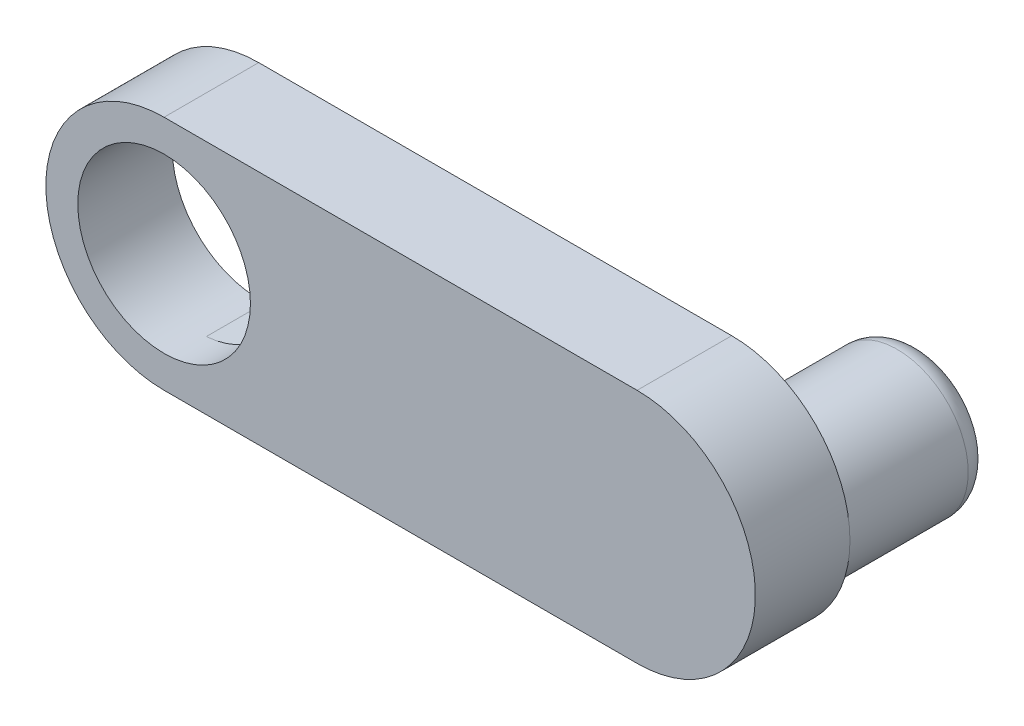
ISO-10303-21;
HEADER;
FILE_DESCRIPTION(('STEP AP214'),'2;1');
FILE_NAME('part.step','',(''),(''),'','','');
FILE_SCHEMA(('AUTOMOTIVE_DESIGN { 1 0 10303 214 1 1 1 1 }'));
ENDSEC;
DATA;
#1=APPLICATION_CONTEXT('core data for automotive mechanical design processes');
#2=APPLICATION_PROTOCOL_DEFINITION('international standard','automotive_design',2000,#1);
#3=PRODUCT_CONTEXT('',#1,'mechanical');
#4=PRODUCT('Part','Part','',(#3));
#5=PRODUCT_RELATED_PRODUCT_CATEGORY('part','',(#4));
#6=PRODUCT_DEFINITION_FORMATION('','',#4);
#7=PRODUCT_DEFINITION_CONTEXT('part definition',#1,'design');
#8=PRODUCT_DEFINITION('design','',#6,#7);
#9=PRODUCT_DEFINITION_SHAPE('','',#8);
#10=(LENGTH_UNIT() NAMED_UNIT(*) SI_UNIT(.MILLI.,.METRE.));
#11=(NAMED_UNIT(*) PLANE_ANGLE_UNIT() SI_UNIT($,.RADIAN.));
#12=(NAMED_UNIT(*) SI_UNIT($,.STERADIAN.) SOLID_ANGLE_UNIT());
#13=UNCERTAINTY_MEASURE_WITH_UNIT(LENGTH_MEASURE(1.E-05),#10,'distance_accuracy_value','');
#14=(GEOMETRIC_REPRESENTATION_CONTEXT(3) GLOBAL_UNCERTAINTY_ASSIGNED_CONTEXT((#13)) GLOBAL_UNIT_ASSIGNED_CONTEXT((#10,
#11,#12)) REPRESENTATION_CONTEXT('',''));
#15=CARTESIAN_POINT('',(0.,0.,0.));
#16=DIRECTION('',(0.,0.,1.));
#17=DIRECTION('',(1.,0.,0.));
#18=AXIS2_PLACEMENT_3D('',#15,#16,#17);
#19=CARTESIAN_POINT('',(0.,0.,4.));
#20=DIRECTION('',(0.,0.,-1.));
#21=DIRECTION('',(-1.,0.,0.));
#22=AXIS2_PLACEMENT_3D('',#19,#20,#21);
#23=CYLINDRICAL_SURFACE('',#22,5.);
#24=CARTESIAN_POINT('',(0.,0.,0.));
#25=DIRECTION('',(0.,0.,1.));
#26=DIRECTION('',(1.,0.,0.));
#27=AXIS2_PLACEMENT_3D('',#24,#25,#26);
#28=CIRCLE('',#27,5.);
#29=CARTESIAN_POINT('',(0.,5.,0.));
#30=VERTEX_POINT('',#29);
#31=CARTESIAN_POINT('',(0.,-5.,0.));
#32=VERTEX_POINT('',#31);
#33=EDGE_CURVE('E145',#30,#32,#28,.T.);
#34=ORIENTED_EDGE('',*,*,#33,.T.);
#35=DIRECTION('',(0.,0.,-1.));
#36=VECTOR('',#35,1.);
#37=CARTESIAN_POINT('',(0.,-5.,4.));
#38=LINE('',#37,#36);
#39=CARTESIAN_POINT('',(0.,-5.,4.));
#40=VERTEX_POINT('',#39);
#41=EDGE_CURVE('E175',#40,#32,#38,.T.);
#42=ORIENTED_EDGE('',*,*,#41,.F.);
#43=CARTESIAN_POINT('',(0.,0.,4.));
#44=DIRECTION('',(0.,0.,1.));
#45=DIRECTION('',(1.,0.,0.));
#46=AXIS2_PLACEMENT_3D('',#43,#44,#45);
#47=CIRCLE('',#46,5.);
#48=CARTESIAN_POINT('',(0.,5.,4.));
#49=VERTEX_POINT('',#48);
#50=EDGE_CURVE('E141',#49,#40,#47,.T.);
#51=ORIENTED_EDGE('',*,*,#50,.F.);
#52=DIRECTION('',(0.,0.,-1.));
#53=VECTOR('',#52,1.);
#54=CARTESIAN_POINT('',(0.,5.,4.));
#55=LINE('',#54,#53);
#56=EDGE_CURVE('E153',#49,#30,#55,.T.);
#57=ORIENTED_EDGE('',*,*,#56,.T.);
#58=EDGE_LOOP('',(#34,#42,#51,#57));
#59=FACE_BOUND('',#58,.T.);
#60=ADVANCED_FACE('F41',(#59),#23,.T.);
#61=CARTESIAN_POINT('',(0.,-5.,4.));
#62=DIRECTION('',(0.,1.,0.));
#63=DIRECTION('',(0.,0.,1.));
#64=AXIS2_PLACEMENT_3D('',#61,#62,#63);
#65=PLANE('',#64);
#66=DIRECTION('',(1.,0.,0.));
#67=VECTOR('',#66,1.);
#68=CARTESIAN_POINT('',(0.,-5.,0.));
#69=LINE('',#68,#67);
#70=CARTESIAN_POINT('',(20.,-5.,0.));
#71=VERTEX_POINT('',#70);
#72=EDGE_CURVE('E160',#32,#71,#69,.T.);
#73=ORIENTED_EDGE('',*,*,#72,.T.);
#74=DIRECTION('',(0.,0.,-1.));
#75=VECTOR('',#74,1.);
#76=CARTESIAN_POINT('',(20.,-5.,4.));
#77=LINE('',#76,#75);
#78=CARTESIAN_POINT('',(20.,-5.,4.));
#79=VERTEX_POINT('',#78);
#80=EDGE_CURVE('E169',#79,#71,#77,.T.);
#81=ORIENTED_EDGE('',*,*,#80,.F.);
#82=DIRECTION('',(1.,0.,0.));
#83=VECTOR('',#82,1.);
#84=CARTESIAN_POINT('',(0.,-5.,4.));
#85=LINE('',#84,#83);
#86=EDGE_CURVE('E147',#40,#79,#85,.T.);
#87=ORIENTED_EDGE('',*,*,#86,.F.);
#88=ORIENTED_EDGE('',*,*,#41,.T.);
#89=EDGE_LOOP('',(#73,#81,#87,#88));
#90=FACE_BOUND('',#89,.T.);
#91=ADVANCED_FACE('F186',(#90),#65,.F.);
#92=CARTESIAN_POINT('',(20.,0.,4.));
#93=DIRECTION('',(0.,0.,-1.));
#94=DIRECTION('',(-1.,0.,0.));
#95=AXIS2_PLACEMENT_3D('',#92,#93,#94);
#96=CYLINDRICAL_SURFACE('',#95,5.);
#97=CARTESIAN_POINT('',(20.,0.,0.));
#98=DIRECTION('',(0.,0.,1.));
#99=DIRECTION('',(1.,0.,0.));
#100=AXIS2_PLACEMENT_3D('',#97,#98,#99);
#101=CIRCLE('',#100,5.);
#102=CARTESIAN_POINT('',(25.,0.,0.));
#103=VERTEX_POINT('',#102);
#104=EDGE_CURVE('E158',#71,#103,#101,.T.);
#105=ORIENTED_EDGE('',*,*,#104,.T.);
#106=CARTESIAN_POINT('',(20.,5.,0.));
#107=VERTEX_POINT('',#106);
#108=EDGE_CURVE('E156',#103,#107,#101,.T.);
#109=ORIENTED_EDGE('',*,*,#108,.T.);
#110=DIRECTION('',(0.,0.,-1.));
#111=VECTOR('',#110,1.);
#112=CARTESIAN_POINT('',(20.,5.,4.));
#113=LINE('',#112,#111);
#114=CARTESIAN_POINT('',(20.,5.,4.));
#115=VERTEX_POINT('',#114);
#116=EDGE_CURVE('E168',#115,#107,#113,.T.);
#117=ORIENTED_EDGE('',*,*,#116,.F.);
#118=CARTESIAN_POINT('',(20.,0.,4.));
#119=DIRECTION('',(0.,0.,1.));
#120=DIRECTION('',(1.,0.,0.));
#121=AXIS2_PLACEMENT_3D('',#118,#119,#120);
#122=CIRCLE('',#121,5.);
#123=EDGE_CURVE('E146',#79,#115,#122,.T.);
#124=ORIENTED_EDGE('',*,*,#123,.F.);
#125=ORIENTED_EDGE('',*,*,#80,.T.);
#126=EDGE_LOOP('',(#105,#109,#117,#124,#125));
#127=FACE_BOUND('',#126,.T.);
#128=ADVANCED_FACE('F191',(#127),#96,.T.);
#129=CARTESIAN_POINT('',(0.,5.,4.));
#130=DIRECTION('',(0.,1.,0.));
#131=DIRECTION('',(0.,0.,1.));
#132=AXIS2_PLACEMENT_3D('',#129,#130,#131);
#133=PLANE('',#132);
#134=DIRECTION('',(1.,0.,0.));
#135=VECTOR('',#134,1.);
#136=CARTESIAN_POINT('',(0.,5.,0.));
#137=LINE('',#136,#135);
#138=EDGE_CURVE('E150',#30,#107,#137,.T.);
#139=ORIENTED_EDGE('',*,*,#138,.F.);
#140=ORIENTED_EDGE('',*,*,#56,.F.);
#141=DIRECTION('',(1.,0.,0.));
#142=VECTOR('',#141,1.);
#143=CARTESIAN_POINT('',(0.,5.,4.));
#144=LINE('',#143,#142);
#145=EDGE_CURVE('E151',#49,#115,#144,.T.);
#146=ORIENTED_EDGE('',*,*,#145,.T.);
#147=ORIENTED_EDGE('',*,*,#116,.T.);
#148=EDGE_LOOP('',(#139,#140,#146,#147));
#149=FACE_BOUND('',#148,.T.);
#150=ADVANCED_FACE('F200',(#149),#133,.T.);
#151=CARTESIAN_POINT('',(0.,0.,4.));
#152=DIRECTION('',(0.,0.,1.));
#153=DIRECTION('',(1.,0.,0.));
#154=AXIS2_PLACEMENT_3D('',#151,#152,#153);
#155=PLANE('',#154);
#156=CARTESIAN_POINT('',(0.,0.,4.));
#157=DIRECTION('',(0.,0.,-1.));
#158=DIRECTION('',(-1.,0.,0.));
#159=AXIS2_PLACEMENT_3D('',#156,#157,#158);
#160=CIRCLE('',#159,3.65);
#161=CARTESIAN_POINT('',(-3.65,0.,4.));
#162=VERTEX_POINT('',#161);
#163=EDGE_CURVE('E118',#162,#162,#160,.T.);
#164=ORIENTED_EDGE('',*,*,#163,.T.);
#165=EDGE_LOOP('',(#164));
#166=FACE_BOUND('',#165,.T.);
#167=ORIENTED_EDGE('',*,*,#50,.T.);
#168=ORIENTED_EDGE('',*,*,#86,.T.);
#169=ORIENTED_EDGE('',*,*,#123,.T.);
#170=ORIENTED_EDGE('',*,*,#145,.F.);
#171=EDGE_LOOP('',(#167,#168,#169,#170));
#172=FACE_BOUND('',#171,.T.);
#173=ADVANCED_FACE('F201',(#166,#172),#155,.T.);
#174=CARTESIAN_POINT('',(0.,0.,0.));
#175=DIRECTION('',(0.,0.,1.));
#176=DIRECTION('',(1.,0.,0.));
#177=AXIS2_PLACEMENT_3D('',#174,#175,#176);
#178=PLANE('',#177);
#179=DIRECTION('',(-0.996943571309329,-0.0781250000000001,0.));
#180=VECTOR('',#179,1.);
#181=CARTESIAN_POINT('',(16.1875,-2.39266457114239,0.));
#182=LINE('',#181,#180);
#183=CARTESIAN_POINT('',(16.1875,-2.39266457114239,0.));
#184=VERTEX_POINT('',#183);
#185=CARTESIAN_POINT('',(0.285156250000001,-3.63884403527905,0.));
#186=VERTEX_POINT('',#185);
#187=EDGE_CURVE('E315',#184,#186,#182,.T.);
#188=ORIENTED_EDGE('',*,*,#187,.F.);
#189=CARTESIAN_POINT('',(16.,0.,0.));
#190=DIRECTION('',(0.,0.,-1.));
#191=DIRECTION('',(-1.,0.,0.));
#192=AXIS2_PLACEMENT_3D('',#189,#190,#191);
#193=CIRCLE('',#192,2.4);
#194=CARTESIAN_POINT('',(16.1875,2.39266457114239,0.));
#195=VERTEX_POINT('',#194);
#196=EDGE_CURVE('E57',#195,#184,#193,.T.);
#197=ORIENTED_EDGE('',*,*,#196,.F.);
#198=DIRECTION('',(-0.996943571309329,0.0781250000000001,0.));
#199=VECTOR('',#198,1.);
#200=CARTESIAN_POINT('',(16.1875,2.39266457114239,0.));
#201=LINE('',#200,#199);
#202=CARTESIAN_POINT('',(0.28515625,3.63884403527905,0.));
#203=VERTEX_POINT('',#202);
#204=EDGE_CURVE('E314',#195,#203,#201,.T.);
#205=ORIENTED_EDGE('',*,*,#204,.T.);
#206=CARTESIAN_POINT('',(0.,0.,0.));
#207=DIRECTION('',(0.,0.,-1.));
#208=DIRECTION('',(-1.,0.,0.));
#209=AXIS2_PLACEMENT_3D('',#206,#207,#208);
#210=CIRCLE('',#209,3.65);
#211=EDGE_CURVE('E132',#186,#203,#210,.T.);
#212=ORIENTED_EDGE('',*,*,#211,.F.);
#213=EDGE_LOOP('',(#188,#197,#205,#212));
#214=FACE_BOUND('',#213,.T.);
#215=ORIENTED_EDGE('',*,*,#108,.F.);
#216=CARTESIAN_POINT('',(22.,0.,0.));
#217=DIRECTION('',(0.,0.,1.));
#218=DIRECTION('',(1.,0.,0.));
#219=AXIS2_PLACEMENT_3D('',#216,#217,#218);
#220=CIRCLE('',#219,3.);
#221=EDGE_CURVE('E65',#103,#103,#220,.T.);
#222=ORIENTED_EDGE('',*,*,#221,.T.);
#223=ORIENTED_EDGE('',*,*,#104,.F.);
#224=ORIENTED_EDGE('',*,*,#72,.F.);
#225=ORIENTED_EDGE('',*,*,#33,.F.);
#226=ORIENTED_EDGE('',*,*,#138,.T.);
#227=EDGE_LOOP('',(#215,#222,#223,#224,#225,#226));
#228=FACE_BOUND('',#227,.T.);
#229=ADVANCED_FACE('F207',(#214,#228),#178,.F.);
#230=CARTESIAN_POINT('',(22.,0.,-6.));
#231=DIRECTION('',(0.,0.,1.));
#232=DIRECTION('',(1.,0.,0.));
#233=AXIS2_PLACEMENT_3D('',#230,#231,#232);
#234=CYLINDRICAL_SURFACE('',#233,3.);
#235=CARTESIAN_POINT('',(22.,0.,-5.));
#236=DIRECTION('',(0.,0.,1.));
#237=DIRECTION('',(1.,0.,0.));
#238=AXIS2_PLACEMENT_3D('',#235,#236,#237);
#239=CIRCLE('',#238,3.);
#240=CARTESIAN_POINT('',(25.,0.,-5.));
#241=VERTEX_POINT('',#240);
#242=EDGE_CURVE('E47',#241,#241,#239,.T.);
#243=ORIENTED_EDGE('',*,*,#242,.T.);
#244=EDGE_LOOP('',(#243));
#245=FACE_BOUND('',#244,.T.);
#246=ORIENTED_EDGE('',*,*,#221,.F.);
#247=EDGE_LOOP('',(#246));
#248=FACE_BOUND('',#247,.T.);
#249=ADVANCED_FACE('F180',(#245,#248),#234,.T.);
#250=CARTESIAN_POINT('',(22.,0.,-6.));
#251=DIRECTION('',(0.,0.,1.));
#252=DIRECTION('',(1.,0.,0.));
#253=AXIS2_PLACEMENT_3D('',#250,#251,#252);
#254=PLANE('',#253);
#255=CARTESIAN_POINT('',(22.,0.,-6.));
#256=DIRECTION('',(0.,0.,1.));
#257=DIRECTION('',(1.,0.,0.));
#258=AXIS2_PLACEMENT_3D('',#255,#256,#257);
#259=CIRCLE('',#258,2.);
#260=CARTESIAN_POINT('',(24.,0.,-6.));
#261=VERTEX_POINT('',#260);
#262=EDGE_CURVE('E11',#261,#261,#259,.F.);
#263=ORIENTED_EDGE('',*,*,#262,.T.);
#264=EDGE_LOOP('',(#263));
#265=FACE_BOUND('',#264,.T.);
#266=ADVANCED_FACE('F213',(#265),#254,.F.);
#267=CARTESIAN_POINT('',(16.,0.,2.5));
#268=DIRECTION('',(0.,0.,-1.));
#269=DIRECTION('',(-1.,0.,0.));
#270=AXIS2_PLACEMENT_3D('',#267,#268,#269);
#271=CYLINDRICAL_SURFACE('',#270,2.4);
#272=ORIENTED_EDGE('',*,*,#196,.T.);
#273=DIRECTION('',(0.,0.,-1.));
#274=VECTOR('',#273,1.);
#275=CARTESIAN_POINT('',(16.1875,-2.39266457114239,2.5));
#276=LINE('',#275,#274);
#277=CARTESIAN_POINT('',(16.1875,-2.39266457114239,2.5));
#278=VERTEX_POINT('',#277);
#279=EDGE_CURVE('E130',#278,#184,#276,.T.);
#280=ORIENTED_EDGE('',*,*,#279,.F.);
#281=CARTESIAN_POINT('',(16.,0.,2.5));
#282=DIRECTION('',(0.,0.,-1.));
#283=DIRECTION('',(-1.,0.,0.));
#284=AXIS2_PLACEMENT_3D('',#281,#282,#283);
#285=CIRCLE('',#284,2.4);
#286=CARTESIAN_POINT('',(16.1875,2.39266457114239,2.5));
#287=VERTEX_POINT('',#286);
#288=EDGE_CURVE('E320',#287,#278,#285,.T.);
#289=ORIENTED_EDGE('',*,*,#288,.F.);
#290=DIRECTION('',(0.,0.,-1.));
#291=VECTOR('',#290,1.);
#292=CARTESIAN_POINT('',(16.1875,2.39266457114239,2.5));
#293=LINE('',#292,#291);
#294=EDGE_CURVE('E127',#287,#195,#293,.T.);
#295=ORIENTED_EDGE('',*,*,#294,.T.);
#296=EDGE_LOOP('',(#272,#280,#289,#295));
#297=FACE_BOUND('',#296,.T.);
#298=ADVANCED_FACE('F217',(#297),#271,.F.);
#299=CARTESIAN_POINT('',(16.1875,2.39266457114239,2.5));
#300=DIRECTION('',(-0.0781250000000001,-0.99694357130933,0.));
#301=DIRECTION('',(0.99694357130933,-0.0781250000000001,0.));
#302=AXIS2_PLACEMENT_3D('',#299,#300,#301);
#303=PLANE('',#302);
#304=ORIENTED_EDGE('',*,*,#204,.F.);
#305=ORIENTED_EDGE('',*,*,#294,.F.);
#306=DIRECTION('',(-0.996943571309329,0.0781250000000001,0.));
#307=VECTOR('',#306,1.);
#308=CARTESIAN_POINT('',(16.1875,2.39266457114239,2.5));
#309=LINE('',#308,#307);
#310=CARTESIAN_POINT('',(0.28515625,3.63884403527905,2.5));
#311=VERTEX_POINT('',#310);
#312=EDGE_CURVE('E115',#287,#311,#309,.T.);
#313=ORIENTED_EDGE('',*,*,#312,.T.);
#314=DIRECTION('',(0.,0.,-1.));
#315=VECTOR('',#314,1.);
#316=CARTESIAN_POINT('',(0.28515625,3.63884403527905,2.5));
#317=LINE('',#316,#315);
#318=EDGE_CURVE('E121',#311,#203,#317,.T.);
#319=ORIENTED_EDGE('',*,*,#318,.T.);
#320=EDGE_LOOP('',(#304,#305,#313,#319));
#321=FACE_BOUND('',#320,.T.);
#322=ADVANCED_FACE('F124',(#321),#303,.T.);
#323=CARTESIAN_POINT('',(0.,0.,2.5));
#324=DIRECTION('',(0.,0.,-1.));
#325=DIRECTION('',(-1.,0.,0.));
#326=AXIS2_PLACEMENT_3D('',#323,#324,#325);
#327=CYLINDRICAL_SURFACE('',#326,3.65);
#328=ORIENTED_EDGE('',*,*,#211,.T.);
#329=ORIENTED_EDGE('',*,*,#318,.F.);
#330=CARTESIAN_POINT('',(0.,0.,2.5));
#331=DIRECTION('',(0.,0.,-1.));
#332=DIRECTION('',(-1.,0.,0.));
#333=AXIS2_PLACEMENT_3D('',#330,#331,#332);
#334=CIRCLE('',#333,3.65);
#335=CARTESIAN_POINT('',(0.285156250000001,-3.63884403527905,2.5));
#336=VERTEX_POINT('',#335);
#337=EDGE_CURVE('E108',#311,#336,#334,.T.);
#338=ORIENTED_EDGE('',*,*,#337,.T.);
#339=DIRECTION('',(0.,0.,-1.));
#340=VECTOR('',#339,1.);
#341=CARTESIAN_POINT('',(0.285156250000001,-3.63884403527905,2.5));
#342=LINE('',#341,#340);
#343=EDGE_CURVE('E133',#336,#186,#342,.T.);
#344=ORIENTED_EDGE('',*,*,#343,.T.);
#345=EDGE_LOOP('',(#328,#329,#338,#344));
#346=FACE_BOUND('',#345,.T.);
#347=ORIENTED_EDGE('',*,*,#163,.F.);
#348=EDGE_LOOP('',(#347));
#349=FACE_BOUND('',#348,.T.);
#350=ADVANCED_FACE('F126',(#346,#349),#327,.F.);
#351=CARTESIAN_POINT('',(16.1875,-2.39266457114239,2.5));
#352=DIRECTION('',(0.0781250000000001,-0.99694357130933,0.));
#353=DIRECTION('',(0.99694357130933,0.0781250000000001,0.));
#354=AXIS2_PLACEMENT_3D('',#351,#352,#353);
#355=PLANE('',#354);
#356=ORIENTED_EDGE('',*,*,#187,.T.);
#357=ORIENTED_EDGE('',*,*,#343,.F.);
#358=DIRECTION('',(-0.996943571309329,-0.0781250000000001,0.));
#359=VECTOR('',#358,1.);
#360=CARTESIAN_POINT('',(16.1875,-2.39266457114239,2.5));
#361=LINE('',#360,#359);
#362=EDGE_CURVE('E114',#278,#336,#361,.T.);
#363=ORIENTED_EDGE('',*,*,#362,.F.);
#364=ORIENTED_EDGE('',*,*,#279,.T.);
#365=EDGE_LOOP('',(#356,#357,#363,#364));
#366=FACE_BOUND('',#365,.T.);
#367=ADVANCED_FACE('F184',(#366),#355,.F.);
#368=CARTESIAN_POINT('',(16.,0.,2.5));
#369=DIRECTION('',(0.,0.,-1.));
#370=DIRECTION('',(-1.,0.,0.));
#371=AXIS2_PLACEMENT_3D('',#368,#369,#370);
#372=PLANE('',#371);
#373=ORIENTED_EDGE('',*,*,#337,.F.);
#374=ORIENTED_EDGE('',*,*,#312,.F.);
#375=ORIENTED_EDGE('',*,*,#288,.T.);
#376=ORIENTED_EDGE('',*,*,#362,.T.);
#377=EDGE_LOOP('',(#373,#374,#375,#376));
#378=FACE_BOUND('',#377,.T.);
#379=ADVANCED_FACE('F109',(#378),#372,.T.);
#380=CARTESIAN_POINT('',(22.,0.,-5.));
#381=DIRECTION('',(0.,0.,1.));
#382=DIRECTION('',(1.,0.,0.));
#383=AXIS2_PLACEMENT_3D('',#380,#381,#382);
#384=TOROIDAL_SURFACE('',#383,2.,1.);
#385=ORIENTED_EDGE('',*,*,#262,.F.);
#386=EDGE_LOOP('',(#385));
#387=FACE_BOUND('',#386,.T.);
#388=ORIENTED_EDGE('',*,*,#242,.F.);
#389=EDGE_LOOP('',(#388));
#390=FACE_BOUND('',#389,.T.);
#391=ADVANCED_FACE('F43',(#387,#390),#384,.T.);
#392=CLOSED_SHELL('',(#60,#91,#128,#150,#173,#229,#249,#266,#298,#322,#350,#367,#379,#391));
#393=MANIFOLD_SOLID_BREP('B2',#392);
#394=ADVANCED_BREP_SHAPE_REPRESENTATION('',(#18,#393),#14);
#395=SHAPE_DEFINITION_REPRESENTATION(#9,#394);
ENDSEC;
END-ISO-10303-21;
